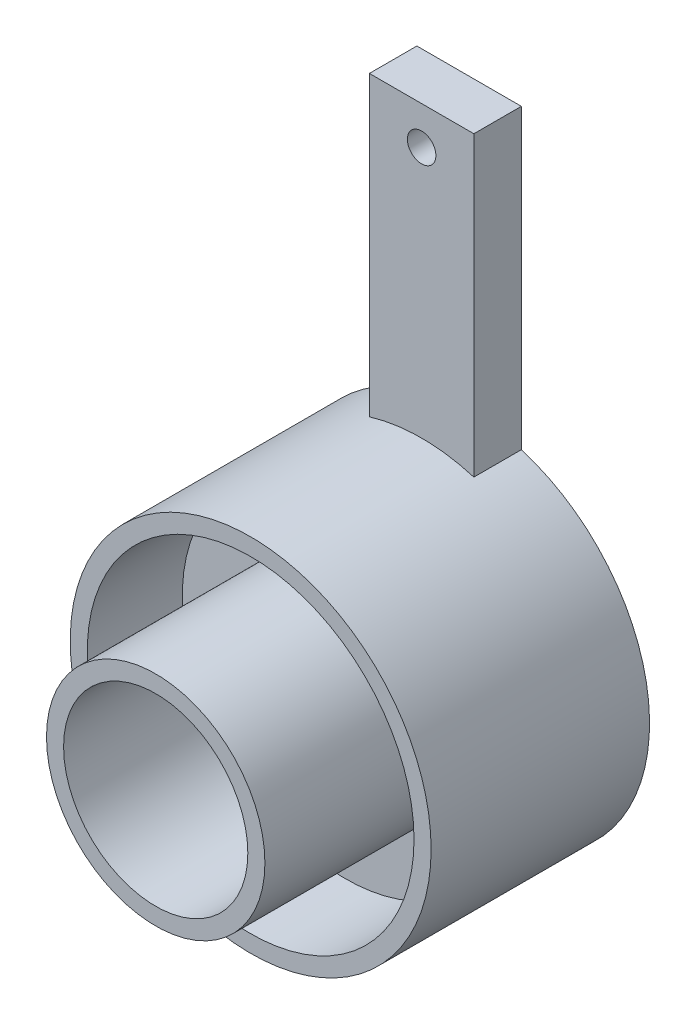
ISO-10303-21;
HEADER;
FILE_DESCRIPTION(('STEP AP214'),'2;1');
FILE_NAME('part.step','',(''),(''),'','','');
FILE_SCHEMA(('AUTOMOTIVE_DESIGN { 1 0 10303 214 1 1 1 1 }'));
ENDSEC;
DATA;
#1=APPLICATION_CONTEXT('core data for automotive mechanical design processes');
#2=APPLICATION_PROTOCOL_DEFINITION('international standard','automotive_design',2000,#1);
#3=PRODUCT_CONTEXT('',#1,'mechanical');
#4=PRODUCT('Part','Part','',(#3));
#5=PRODUCT_RELATED_PRODUCT_CATEGORY('part','',(#4));
#6=PRODUCT_DEFINITION_FORMATION('','',#4);
#7=PRODUCT_DEFINITION_CONTEXT('part definition',#1,'design');
#8=PRODUCT_DEFINITION('design','',#6,#7);
#9=PRODUCT_DEFINITION_SHAPE('','',#8);
#10=(LENGTH_UNIT() NAMED_UNIT(*) SI_UNIT(.MILLI.,.METRE.));
#11=(NAMED_UNIT(*) PLANE_ANGLE_UNIT() SI_UNIT($,.RADIAN.));
#12=(NAMED_UNIT(*) SI_UNIT($,.STERADIAN.) SOLID_ANGLE_UNIT());
#13=UNCERTAINTY_MEASURE_WITH_UNIT(LENGTH_MEASURE(1.E-05),#10,'distance_accuracy_value','');
#14=(GEOMETRIC_REPRESENTATION_CONTEXT(3) GLOBAL_UNCERTAINTY_ASSIGNED_CONTEXT((#13)) GLOBAL_UNIT_ASSIGNED_CONTEXT((#10,
#11,#12)) REPRESENTATION_CONTEXT('',''));
#15=CARTESIAN_POINT('',(0.,0.,0.));
#16=DIRECTION('',(0.,0.,1.));
#17=DIRECTION('',(1.,0.,0.));
#18=AXIS2_PLACEMENT_3D('',#15,#16,#17);
#19=CARTESIAN_POINT('',(0.,0.,23.));
#20=DIRECTION('',(0.,0.,-1.));
#21=DIRECTION('',(-1.,0.,0.));
#22=AXIS2_PLACEMENT_3D('',#19,#20,#21);
#23=CYLINDRICAL_SURFACE('',#22,19.);
#24=CARTESIAN_POINT('',(0.,0.,23.));
#25=DIRECTION('',(0.,0.,1.));
#26=DIRECTION('',(1.,0.,0.));
#27=AXIS2_PLACEMENT_3D('',#24,#25,#26);
#28=CIRCLE('',#27,19.);
#29=CARTESIAN_POINT('',(19.,0.,23.));
#30=VERTEX_POINT('',#29);
#31=EDGE_CURVE('E271',#30,#30,#28,.T.);
#32=ORIENTED_EDGE('',*,*,#31,.F.);
#33=EDGE_LOOP('',(#32));
#34=FACE_BOUND('',#33,.T.);
#35=CARTESIAN_POINT('',(0.,0.,0.));
#36=DIRECTION('',(0.,0.,1.));
#37=DIRECTION('',(1.,0.,0.));
#38=AXIS2_PLACEMENT_3D('',#35,#36,#37);
#39=CIRCLE('',#38,19.);
#40=CARTESIAN_POINT('',(-5.5,18.1865334794732,0.));
#41=VERTEX_POINT('',#40);
#42=CARTESIAN_POINT('',(5.5,18.1865334794732,0.));
#43=VERTEX_POINT('',#42);
#44=EDGE_CURVE('E268',#41,#43,#39,.T.);
#45=ORIENTED_EDGE('',*,*,#44,.T.);
#46=DIRECTION('',(0.,0.,-1.));
#47=VECTOR('',#46,1.);
#48=CARTESIAN_POINT('',(5.5,18.1865334794732,23.));
#49=LINE('',#48,#47);
#50=CARTESIAN_POINT('',(5.5,18.1865334794732,5.));
#51=VERTEX_POINT('',#50);
#52=EDGE_CURVE('E232',#43,#51,#49,.F.);
#53=ORIENTED_EDGE('',*,*,#52,.T.);
#54=CARTESIAN_POINT('',(0.,0.,5.));
#55=DIRECTION('',(0.,0.,-1.));
#56=DIRECTION('',(-1.,0.,0.));
#57=AXIS2_PLACEMENT_3D('',#54,#55,#56);
#58=CIRCLE('',#57,19.);
#59=CARTESIAN_POINT('',(-5.5,18.1865334794732,5.));
#60=VERTEX_POINT('',#59);
#61=EDGE_CURVE('E237',#60,#51,#58,.T.);
#62=ORIENTED_EDGE('',*,*,#61,.F.);
#63=DIRECTION('',(0.,0.,-1.));
#64=VECTOR('',#63,1.);
#65=CARTESIAN_POINT('',(-5.5,18.1865334794732,23.));
#66=LINE('',#65,#64);
#67=EDGE_CURVE('E227',#41,#60,#66,.F.);
#68=ORIENTED_EDGE('',*,*,#67,.F.);
#69=EDGE_LOOP('',(#45,#53,#62,#68));
#70=FACE_BOUND('',#69,.T.);
#71=ADVANCED_FACE('F36',(#34,#70),#23,.T.);
#72=CARTESIAN_POINT('',(0.,0.,23.));
#73=DIRECTION('',(0.,0.,1.));
#74=DIRECTION('',(1.,0.,0.));
#75=AXIS2_PLACEMENT_3D('',#72,#73,#74);
#76=PLANE('',#75);
#77=CARTESIAN_POINT('',(0.,0.,23.));
#78=DIRECTION('',(0.,0.,1.));
#79=DIRECTION('',(1.,0.,0.));
#80=AXIS2_PLACEMENT_3D('',#77,#78,#79);
#81=CIRCLE('',#80,17.2);
#82=CARTESIAN_POINT('',(17.2,0.,23.));
#83=VERTEX_POINT('',#82);
#84=EDGE_CURVE('E262',#83,#83,#81,.T.);
#85=ORIENTED_EDGE('',*,*,#84,.F.);
#86=EDGE_LOOP('',(#85));
#87=FACE_BOUND('',#86,.T.);
#88=ORIENTED_EDGE('',*,*,#31,.T.);
#89=EDGE_LOOP('',(#88));
#90=FACE_BOUND('',#89,.T.);
#91=ADVANCED_FACE('F313',(#87,#90),#76,.T.);
#92=CARTESIAN_POINT('',(0.,0.,0.));
#93=DIRECTION('',(0.,0.,1.));
#94=DIRECTION('',(1.,0.,0.));
#95=AXIS2_PLACEMENT_3D('',#92,#93,#94);
#96=PLANE('',#95);
#97=CARTESIAN_POINT('',(0.,45.5,0.));
#98=DIRECTION('',(0.,0.,-1.));
#99=DIRECTION('',(-1.,0.,0.));
#100=AXIS2_PLACEMENT_3D('',#97,#98,#99);
#101=CIRCLE('',#100,1.5);
#102=CARTESIAN_POINT('',(-1.5,45.5,0.));
#103=VERTEX_POINT('',#102);
#104=EDGE_CURVE('E301',#103,#103,#101,.T.);
#105=ORIENTED_EDGE('',*,*,#104,.F.);
#106=EDGE_LOOP('',(#105));
#107=FACE_BOUND('',#106,.T.);
#108=DIRECTION('',(0.988029503398198,-0.154265033026643,0.));
#109=VECTOR('',#108,1.);
#110=CARTESIAN_POINT('',(6.8709063836232,-2.36084183276174,0.));
#111=LINE('',#110,#109);
#112=CARTESIAN_POINT('',(6.8709063836232,-2.36084183276174,0.));
#113=VERTEX_POINT('',#112);
#114=CARTESIAN_POINT('',(9.30471822858186,-2.74084269645241,0.));
#115=VERTEX_POINT('',#114);
#116=EDGE_CURVE('E186',#113,#115,#111,.T.);
#117=ORIENTED_EDGE('',*,*,#116,.T.);
#118=CARTESIAN_POINT('',(0.,0.,0.));
#119=DIRECTION('',(0.,0.,-1.));
#120=DIRECTION('',(-1.,0.,0.));
#121=AXIS2_PLACEMENT_3D('',#118,#119,#120);
#122=CIRCLE('',#121,9.7);
#123=CARTESIAN_POINT('',(7.71247727898932,-5.88283045999743,0.));
#124=VERTEX_POINT('',#123);
#125=EDGE_CURVE('E240',#124,#115,#122,.T.);
#126=ORIENTED_EDGE('',*,*,#125,.F.);
#127=DIRECTION('',(-0.708657947835514,0.705552204283679,0.));
#128=VECTOR('',#127,1.);
#129=CARTESIAN_POINT('',(13.0534205171976,-11.2003666369099,0.));
#130=LINE('',#129,#128);
#131=CARTESIAN_POINT('',(5.96684103884249,-4.14484459407309,0.));
#132=VERTEX_POINT('',#131);
#133=EDGE_CURVE('E183',#124,#132,#130,.T.);
#134=ORIENTED_EDGE('',*,*,#133,.T.);
#135=DIRECTION('',(0.452032672390356,0.892001380655676,0.));
#136=VECTOR('',#135,1.);
#137=CARTESIAN_POINT('',(5.96684103884249,-4.14484459407309,0.));
#138=LINE('',#137,#136);
#139=EDGE_CURVE('E168',#132,#113,#138,.T.);
#140=ORIENTED_EDGE('',*,*,#139,.T.);
#141=EDGE_LOOP('',(#117,#126,#134,#140));
#142=FACE_BOUND('',#141,.T.);
#143=CARTESIAN_POINT('',(13.0534205171976,-11.2003666369099,0.));
#144=VERTEX_POINT('',#143);
#145=CARTESIAN_POINT('',(8.99742489110382,-7.16214669836813,0.));
#146=VERTEX_POINT('',#145);
#147=EDGE_CURVE('E181',#144,#146,#130,.T.);
#148=ORIENTED_EDGE('',*,*,#147,.T.);
#149=CARTESIAN_POINT('',(0.,0.,0.));
#150=DIRECTION('',(0.,0.,-1.));
#151=DIRECTION('',(-1.,0.,0.));
#152=AXIS2_PLACEMENT_3D('',#149,#150,#151);
#153=CIRCLE('',#152,11.5);
#154=CARTESIAN_POINT('',(-5.5,10.0995049383621,0.));
#155=VERTEX_POINT('',#154);
#156=EDGE_CURVE('E247',#146,#155,#153,.T.);
#157=ORIENTED_EDGE('',*,*,#156,.T.);
#158=DIRECTION('',(0.,1.,0.));
#159=VECTOR('',#158,1.);
#160=CARTESIAN_POINT('',(-5.5,0.,0.));
#161=LINE('',#160,#159);
#162=CARTESIAN_POINT('',(-5.5,16.2969322266493,0.));
#163=VERTEX_POINT('',#162);
#164=EDGE_CURVE('E216',#155,#163,#161,.T.);
#165=ORIENTED_EDGE('',*,*,#164,.T.);
#166=CARTESIAN_POINT('',(0.,0.,0.));
#167=DIRECTION('',(0.,0.,-1.));
#168=DIRECTION('',(-1.,0.,0.));
#169=AXIS2_PLACEMENT_3D('',#166,#167,#168);
#170=CIRCLE('',#169,17.2);
#171=EDGE_CURVE('E246',#144,#163,#170,.T.);
#172=ORIENTED_EDGE('',*,*,#171,.F.);
#173=EDGE_LOOP('',(#148,#157,#165,#172));
#174=FACE_BOUND('',#173,.T.);
#175=ORIENTED_EDGE('',*,*,#44,.F.);
#176=CARTESIAN_POINT('',(-5.5,49.5,0.));
#177=VERTEX_POINT('',#176);
#178=EDGE_CURVE('E214',#41,#177,#161,.T.);
#179=ORIENTED_EDGE('',*,*,#178,.T.);
#180=DIRECTION('',(-1.,0.,0.));
#181=VECTOR('',#180,1.);
#182=CARTESIAN_POINT('',(5.5,49.5,0.));
#183=LINE('',#182,#181);
#184=CARTESIAN_POINT('',(5.5,49.5,0.));
#185=VERTEX_POINT('',#184);
#186=EDGE_CURVE('E221',#185,#177,#183,.T.);
#187=ORIENTED_EDGE('',*,*,#186,.F.);
#188=DIRECTION('',(0.,1.,0.));
#189=VECTOR('',#188,1.);
#190=CARTESIAN_POINT('',(5.5,0.,0.));
#191=LINE('',#190,#189);
#192=EDGE_CURVE('E204',#43,#185,#191,.T.);
#193=ORIENTED_EDGE('',*,*,#192,.F.);
#194=EDGE_LOOP('',(#175,#179,#187,#193));
#195=FACE_BOUND('',#194,.T.);
#196=CARTESIAN_POINT('',(5.5,10.0995049383621,0.));
#197=VERTEX_POINT('',#196);
#198=CARTESIAN_POINT('',(11.0962259015966,-3.02055801810482,0.));
#199=VERTEX_POINT('',#198);
#200=EDGE_CURVE('E243',#197,#199,#153,.T.);
#201=ORIENTED_EDGE('',*,*,#200,.T.);
#202=CARTESIAN_POINT('',(16.7512014176052,-3.90349216302817,0.));
#203=VERTEX_POINT('',#202);
#204=EDGE_CURVE('E185',#199,#203,#111,.T.);
#205=ORIENTED_EDGE('',*,*,#204,.T.);
#206=CARTESIAN_POINT('',(5.5,16.2969322266493,0.));
#207=VERTEX_POINT('',#206);
#208=EDGE_CURVE('E254',#207,#203,#170,.T.);
#209=ORIENTED_EDGE('',*,*,#208,.F.);
#210=EDGE_CURVE('E207',#197,#207,#191,.T.);
#211=ORIENTED_EDGE('',*,*,#210,.F.);
#212=EDGE_LOOP('',(#201,#205,#209,#211));
#213=FACE_BOUND('',#212,.T.);
#214=ADVANCED_FACE('F298',(#107,#142,#174,#195,#213),#96,.F.);
#215=CARTESIAN_POINT('',(0.,0.,13.));
#216=DIRECTION('',(0.,0.,1.));
#217=DIRECTION('',(1.,0.,0.));
#218=AXIS2_PLACEMENT_3D('',#215,#216,#217);
#219=CYLINDRICAL_SURFACE('',#218,17.2);
#220=CARTESIAN_POINT('',(0.,0.,13.));
#221=DIRECTION('',(0.,0.,1.));
#222=DIRECTION('',(1.,0.,0.));
#223=AXIS2_PLACEMENT_3D('',#220,#221,#222);
#224=CIRCLE('',#223,17.2);
#225=CARTESIAN_POINT('',(17.2,0.,13.));
#226=VERTEX_POINT('',#225);
#227=EDGE_CURVE('E265',#226,#226,#224,.T.);
#228=ORIENTED_EDGE('',*,*,#227,.F.);
#229=EDGE_LOOP('',(#228));
#230=FACE_BOUND('',#229,.T.);
#231=ORIENTED_EDGE('',*,*,#84,.T.);
#232=EDGE_LOOP('',(#231));
#233=FACE_BOUND('',#232,.T.);
#234=ADVANCED_FACE('F312',(#230,#233),#219,.F.);
#235=CARTESIAN_POINT('',(0.,0.,13.));
#236=DIRECTION('',(0.,0.,1.));
#237=DIRECTION('',(1.,0.,0.));
#238=AXIS2_PLACEMENT_3D('',#235,#236,#237);
#239=PLANE('',#238);
#240=CARTESIAN_POINT('',(0.,0.,13.));
#241=DIRECTION('',(0.,0.,1.));
#242=DIRECTION('',(1.,0.,0.));
#243=AXIS2_PLACEMENT_3D('',#240,#241,#242);
#244=CIRCLE('',#243,11.5);
#245=CARTESIAN_POINT('',(11.5,0.,13.));
#246=VERTEX_POINT('',#245);
#247=EDGE_CURVE('E258',#246,#246,#244,.T.);
#248=ORIENTED_EDGE('',*,*,#247,.F.);
#249=EDGE_LOOP('',(#248));
#250=FACE_BOUND('',#249,.T.);
#251=ORIENTED_EDGE('',*,*,#227,.T.);
#252=EDGE_LOOP('',(#251));
#253=FACE_BOUND('',#252,.T.);
#254=ADVANCED_FACE('F318',(#250,#253),#239,.T.);
#255=CARTESIAN_POINT('',(0.,0.,33.));
#256=DIRECTION('',(0.,0.,1.));
#257=DIRECTION('',(1.,0.,0.));
#258=AXIS2_PLACEMENT_3D('',#255,#256,#257);
#259=PLANE('',#258);
#260=CARTESIAN_POINT('',(0.,0.,33.));
#261=DIRECTION('',(0.,0.,1.));
#262=DIRECTION('',(1.,0.,0.));
#263=AXIS2_PLACEMENT_3D('',#260,#261,#262);
#264=CIRCLE('',#263,11.5);
#265=CARTESIAN_POINT('',(11.5,0.,33.));
#266=VERTEX_POINT('',#265);
#267=EDGE_CURVE('E259',#266,#266,#264,.T.);
#268=ORIENTED_EDGE('',*,*,#267,.T.);
#269=EDGE_LOOP('',(#268));
#270=FACE_BOUND('',#269,.T.);
#271=CARTESIAN_POINT('',(0.,0.,33.));
#272=DIRECTION('',(0.,0.,1.));
#273=DIRECTION('',(1.,0.,0.));
#274=AXIS2_PLACEMENT_3D('',#271,#272,#273);
#275=CIRCLE('',#274,9.7);
#276=CARTESIAN_POINT('',(9.7,0.,33.));
#277=VERTEX_POINT('',#276);
#278=EDGE_CURVE('E253',#277,#277,#275,.T.);
#279=ORIENTED_EDGE('',*,*,#278,.F.);
#280=EDGE_LOOP('',(#279));
#281=FACE_BOUND('',#280,.T.);
#282=ADVANCED_FACE('F423',(#270,#281),#259,.T.);
#283=CARTESIAN_POINT('',(0.,0.,33.));
#284=DIRECTION('',(0.,0.,-1.));
#285=DIRECTION('',(-1.,0.,0.));
#286=AXIS2_PLACEMENT_3D('',#283,#284,#285);
#287=CYLINDRICAL_SURFACE('',#286,11.5);
#288=ORIENTED_EDGE('',*,*,#267,.F.);
#289=EDGE_LOOP('',(#288));
#290=FACE_BOUND('',#289,.T.);
#291=ORIENTED_EDGE('',*,*,#247,.T.);
#292=EDGE_LOOP('',(#291));
#293=FACE_BOUND('',#292,.T.);
#294=ADVANCED_FACE('F421',(#290,#293),#287,.T.);
#295=CARTESIAN_POINT('',(0.,0.,33.));
#296=DIRECTION('',(0.,0.,-1.));
#297=DIRECTION('',(-1.,0.,0.));
#298=AXIS2_PLACEMENT_3D('',#295,#296,#297);
#299=CYLINDRICAL_SURFACE('',#298,9.7);
#300=ORIENTED_EDGE('',*,*,#278,.T.);
#301=EDGE_LOOP('',(#300));
#302=FACE_BOUND('',#301,.T.);
#303=CARTESIAN_POINT('',(0.,0.,13.));
#304=DIRECTION('',(0.,0.,1.));
#305=DIRECTION('',(1.,0.,0.));
#306=AXIS2_PLACEMENT_3D('',#303,#304,#305);
#307=CIRCLE('',#306,9.7);
#308=CARTESIAN_POINT('',(9.7,0.,13.));
#309=VERTEX_POINT('',#308);
#310=EDGE_CURVE('E274',#309,#309,#307,.F.);
#311=ORIENTED_EDGE('',*,*,#310,.T.);
#312=EDGE_LOOP('',(#311));
#313=FACE_BOUND('',#312,.T.);
#314=ADVANCED_FACE('F415',(#302,#313),#299,.F.);
#315=ORIENTED_EDGE('',*,*,#310,.F.);
#316=EDGE_LOOP('',(#315));
#317=FACE_BOUND('',#316,.T.);
#318=ADVANCED_FACE('F410',(#317),#239,.T.);
#319=CARTESIAN_POINT('',(0.,0.,10.));
#320=DIRECTION('',(0.,0.,-1.));
#321=DIRECTION('',(-1.,0.,0.));
#322=AXIS2_PLACEMENT_3D('',#319,#320,#321);
#323=CYLINDRICAL_SURFACE('',#322,17.2);
#324=ORIENTED_EDGE('',*,*,#208,.T.);
#325=DIRECTION('',(0.,0.,-1.));
#326=VECTOR('',#325,1.);
#327=CARTESIAN_POINT('',(16.7512014176052,-3.90349216302817,2.4));
#328=LINE('',#327,#326);
#329=CARTESIAN_POINT('',(16.7512014176052,-3.90349216302817,2.4));
#330=VERTEX_POINT('',#329);
#331=EDGE_CURVE('E51',#330,#203,#328,.T.);
#332=ORIENTED_EDGE('',*,*,#331,.F.);
#333=CARTESIAN_POINT('',(0.,0.,2.4));
#334=DIRECTION('',(0.,0.,-1.));
#335=DIRECTION('',(-1.,0.,0.));
#336=AXIS2_PLACEMENT_3D('',#333,#334,#335);
#337=CIRCLE('',#336,17.2);
#338=CARTESIAN_POINT('',(13.0534205171976,-11.2003666369099,2.4));
#339=VERTEX_POINT('',#338);
#340=EDGE_CURVE('E56',#330,#339,#337,.T.);
#341=ORIENTED_EDGE('',*,*,#340,.T.);
#342=DIRECTION('',(0.,0.,-1.));
#343=VECTOR('',#342,1.);
#344=CARTESIAN_POINT('',(13.0534205171976,-11.2003666369099,2.4));
#345=LINE('',#344,#343);
#346=EDGE_CURVE('E170',#339,#144,#345,.T.);
#347=ORIENTED_EDGE('',*,*,#346,.T.);
#348=ORIENTED_EDGE('',*,*,#171,.T.);
#349=DIRECTION('',(0.,0.,-1.));
#350=VECTOR('',#349,1.);
#351=CARTESIAN_POINT('',(-5.5,16.2969322266493,10.));
#352=LINE('',#351,#350);
#353=CARTESIAN_POINT('',(-5.5,16.2969322266493,5.));
#354=VERTEX_POINT('',#353);
#355=EDGE_CURVE('E224',#354,#163,#352,.T.);
#356=ORIENTED_EDGE('',*,*,#355,.F.);
#357=CARTESIAN_POINT('',(0.,0.,5.));
#358=DIRECTION('',(0.,0.,-1.));
#359=DIRECTION('',(-1.,0.,0.));
#360=AXIS2_PLACEMENT_3D('',#357,#358,#359);
#361=CIRCLE('',#360,17.2);
#362=CARTESIAN_POINT('',(5.5,16.2969322266493,5.));
#363=VERTEX_POINT('',#362);
#364=EDGE_CURVE('E234',#363,#354,#361,.F.);
#365=ORIENTED_EDGE('',*,*,#364,.F.);
#366=DIRECTION('',(0.,0.,-1.));
#367=VECTOR('',#366,1.);
#368=CARTESIAN_POINT('',(5.5,16.2969322266493,10.));
#369=LINE('',#368,#367);
#370=EDGE_CURVE('E230',#363,#207,#369,.T.);
#371=ORIENTED_EDGE('',*,*,#370,.T.);
#372=EDGE_LOOP('',(#324,#332,#341,#347,#348,#356,#365,#371));
#373=FACE_BOUND('',#372,.T.);
#374=CARTESIAN_POINT('',(0.,0.,10.));
#375=DIRECTION('',(0.,0.,-1.));
#376=DIRECTION('',(-1.,0.,0.));
#377=AXIS2_PLACEMENT_3D('',#374,#375,#376);
#378=CIRCLE('',#377,17.2);
#379=CARTESIAN_POINT('',(-17.2,0.,10.));
#380=VERTEX_POINT('',#379);
#381=EDGE_CURVE('E250',#380,#380,#378,.T.);
#382=ORIENTED_EDGE('',*,*,#381,.F.);
#383=EDGE_LOOP('',(#382));
#384=FACE_BOUND('',#383,.T.);
#385=ADVANCED_FACE('F378',(#373,#384),#323,.F.);
#386=CARTESIAN_POINT('',(0.,0.,10.));
#387=DIRECTION('',(0.,0.,-1.));
#388=DIRECTION('',(-1.,0.,0.));
#389=AXIS2_PLACEMENT_3D('',#386,#387,#388);
#390=PLANE('',#389);
#391=CARTESIAN_POINT('',(0.,0.,10.));
#392=DIRECTION('',(0.,0.,-1.));
#393=DIRECTION('',(-1.,0.,0.));
#394=AXIS2_PLACEMENT_3D('',#391,#392,#393);
#395=CIRCLE('',#394,11.5);
#396=CARTESIAN_POINT('',(-11.5,0.,10.));
#397=VERTEX_POINT('',#396);
#398=EDGE_CURVE('E242',#397,#397,#395,.T.);
#399=ORIENTED_EDGE('',*,*,#398,.F.);
#400=EDGE_LOOP('',(#399));
#401=FACE_BOUND('',#400,.T.);
#402=ORIENTED_EDGE('',*,*,#381,.T.);
#403=EDGE_LOOP('',(#402));
#404=FACE_BOUND('',#403,.T.);
#405=ADVANCED_FACE('F401',(#401,#404),#390,.T.);
#406=CARTESIAN_POINT('',(0.,0.,0.));
#407=DIRECTION('',(0.,0.,1.));
#408=DIRECTION('',(1.,0.,0.));
#409=AXIS2_PLACEMENT_3D('',#406,#407,#408);
#410=CYLINDRICAL_SURFACE('',#409,11.5);
#411=CARTESIAN_POINT('',(0.,0.,2.4));
#412=DIRECTION('',(0.,0.,-1.));
#413=DIRECTION('',(-1.,0.,0.));
#414=AXIS2_PLACEMENT_3D('',#411,#412,#413);
#415=CIRCLE('',#414,11.5);
#416=CARTESIAN_POINT('',(11.0962259015966,-3.02055801810482,2.4));
#417=VERTEX_POINT('',#416);
#418=CARTESIAN_POINT('',(8.99742489110382,-7.16214669836813,2.4));
#419=VERTEX_POINT('',#418);
#420=EDGE_CURVE('E190',#417,#419,#415,.T.);
#421=ORIENTED_EDGE('',*,*,#420,.F.);
#422=DIRECTION('',(0.,0.,1.));
#423=VECTOR('',#422,1.);
#424=CARTESIAN_POINT('',(11.0962259015966,-3.02055801810482,0.));
#425=LINE('',#424,#423);
#426=EDGE_CURVE('E197',#417,#199,#425,.F.);
#427=ORIENTED_EDGE('',*,*,#426,.T.);
#428=ORIENTED_EDGE('',*,*,#200,.F.);
#429=DIRECTION('',(0.,0.,1.));
#430=VECTOR('',#429,1.);
#431=CARTESIAN_POINT('',(5.5,10.0995049383621,0.));
#432=LINE('',#431,#430);
#433=CARTESIAN_POINT('',(5.5,10.0995049383621,5.));
#434=VERTEX_POINT('',#433);
#435=EDGE_CURVE('E287',#197,#434,#432,.T.);
#436=ORIENTED_EDGE('',*,*,#435,.T.);
#437=CARTESIAN_POINT('',(0.,0.,5.));
#438=DIRECTION('',(0.,0.,-1.));
#439=DIRECTION('',(-1.,0.,0.));
#440=AXIS2_PLACEMENT_3D('',#437,#438,#439);
#441=CIRCLE('',#440,11.5);
#442=CARTESIAN_POINT('',(-5.5,10.0995049383621,5.));
#443=VERTEX_POINT('',#442);
#444=EDGE_CURVE('E284',#443,#434,#441,.T.);
#445=ORIENTED_EDGE('',*,*,#444,.F.);
#446=DIRECTION('',(0.,0.,1.));
#447=VECTOR('',#446,1.);
#448=CARTESIAN_POINT('',(-5.5,10.0995049383621,0.));
#449=LINE('',#448,#447);
#450=EDGE_CURVE('E281',#155,#443,#449,.T.);
#451=ORIENTED_EDGE('',*,*,#450,.F.);
#452=ORIENTED_EDGE('',*,*,#156,.F.);
#453=DIRECTION('',(0.,0.,1.));
#454=VECTOR('',#453,1.);
#455=CARTESIAN_POINT('',(8.99742489110382,-7.16214669836813,0.));
#456=LINE('',#455,#454);
#457=EDGE_CURVE('E194',#146,#419,#456,.T.);
#458=ORIENTED_EDGE('',*,*,#457,.T.);
#459=EDGE_LOOP('',(#421,#427,#428,#436,#445,#451,#452,#458));
#460=FACE_BOUND('',#459,.T.);
#461=ORIENTED_EDGE('',*,*,#398,.T.);
#462=EDGE_LOOP('',(#461));
#463=FACE_BOUND('',#462,.T.);
#464=ADVANCED_FACE('F398',(#460,#463),#410,.T.);
#465=CARTESIAN_POINT('',(0.,0.,0.));
#466=DIRECTION('',(0.,0.,1.));
#467=DIRECTION('',(1.,0.,0.));
#468=AXIS2_PLACEMENT_3D('',#465,#466,#467);
#469=CYLINDRICAL_SURFACE('',#468,9.7);
#470=DIRECTION('',(0.,0.,1.));
#471=VECTOR('',#470,1.);
#472=CARTESIAN_POINT('',(9.30471822858186,-2.74084269645241,0.));
#473=LINE('',#472,#471);
#474=CARTESIAN_POINT('',(9.30471822858186,-2.74084269645241,2.4));
#475=VERTEX_POINT('',#474);
#476=EDGE_CURVE('E11',#475,#115,#473,.F.);
#477=ORIENTED_EDGE('',*,*,#476,.F.);
#478=CARTESIAN_POINT('',(0.,0.,2.4));
#479=DIRECTION('',(0.,0.,-1.));
#480=DIRECTION('',(-1.,0.,0.));
#481=AXIS2_PLACEMENT_3D('',#478,#479,#480);
#482=CIRCLE('',#481,9.7);
#483=CARTESIAN_POINT('',(7.71247727898932,-5.88283045999743,2.4));
#484=VERTEX_POINT('',#483);
#485=EDGE_CURVE('E289',#475,#484,#482,.T.);
#486=ORIENTED_EDGE('',*,*,#485,.T.);
#487=DIRECTION('',(0.,0.,1.));
#488=VECTOR('',#487,1.);
#489=CARTESIAN_POINT('',(7.71247727898932,-5.88283045999743,0.));
#490=LINE('',#489,#488);
#491=EDGE_CURVE('E44',#124,#484,#490,.T.);
#492=ORIENTED_EDGE('',*,*,#491,.F.);
#493=ORIENTED_EDGE('',*,*,#125,.T.);
#494=EDGE_LOOP('',(#477,#486,#492,#493));
#495=FACE_BOUND('',#494,.T.);
#496=CARTESIAN_POINT('',(0.,0.,10.));
#497=DIRECTION('',(0.,0.,-1.));
#498=DIRECTION('',(-1.,0.,0.));
#499=AXIS2_PLACEMENT_3D('',#496,#497,#498);
#500=CIRCLE('',#499,9.7);
#501=CARTESIAN_POINT('',(-9.7,0.,10.));
#502=VERTEX_POINT('',#501);
#503=EDGE_CURVE('E278',#502,#502,#500,.F.);
#504=ORIENTED_EDGE('',*,*,#503,.T.);
#505=EDGE_LOOP('',(#504));
#506=FACE_BOUND('',#505,.T.);
#507=ADVANCED_FACE('F292',(#495,#506),#469,.F.);
#508=ORIENTED_EDGE('',*,*,#503,.F.);
#509=EDGE_LOOP('',(#508));
#510=FACE_BOUND('',#509,.T.);
#511=ADVANCED_FACE('F368',(#510),#390,.T.);
#512=CARTESIAN_POINT('',(5.5,0.,0.));
#513=DIRECTION('',(1.,0.,0.));
#514=DIRECTION('',(0.,0.,-1.));
#515=AXIS2_PLACEMENT_3D('',#512,#513,#514);
#516=PLANE('',#515);
#517=ORIENTED_EDGE('',*,*,#370,.F.);
#518=DIRECTION('',(0.,-1.,0.));
#519=VECTOR('',#518,1.);
#520=CARTESIAN_POINT('',(5.5,0.,5.));
#521=LINE('',#520,#519);
#522=EDGE_CURVE('E205',#363,#434,#521,.T.);
#523=ORIENTED_EDGE('',*,*,#522,.T.);
#524=ORIENTED_EDGE('',*,*,#435,.F.);
#525=ORIENTED_EDGE('',*,*,#210,.T.);
#526=EDGE_LOOP('',(#517,#523,#524,#525));
#527=FACE_BOUND('',#526,.T.);
#528=ADVANCED_FACE('F358',(#527),#516,.T.);
#529=CARTESIAN_POINT('',(-5.5,0.,0.));
#530=DIRECTION('',(1.,0.,0.));
#531=DIRECTION('',(0.,0.,-1.));
#532=AXIS2_PLACEMENT_3D('',#529,#530,#531);
#533=PLANE('',#532);
#534=DIRECTION('',(0.,-1.,0.));
#535=VECTOR('',#534,1.);
#536=CARTESIAN_POINT('',(-5.5,0.,5.));
#537=LINE('',#536,#535);
#538=EDGE_CURVE('E200',#354,#443,#537,.T.);
#539=ORIENTED_EDGE('',*,*,#538,.F.);
#540=ORIENTED_EDGE('',*,*,#355,.T.);
#541=ORIENTED_EDGE('',*,*,#164,.F.);
#542=ORIENTED_EDGE('',*,*,#450,.T.);
#543=EDGE_LOOP('',(#539,#540,#541,#542));
#544=FACE_BOUND('',#543,.T.);
#545=ADVANCED_FACE('F351',(#544),#533,.F.);
#546=CARTESIAN_POINT('',(5.5,0.,5.));
#547=DIRECTION('',(0.,0.,-1.));
#548=DIRECTION('',(-1.,0.,0.));
#549=AXIS2_PLACEMENT_3D('',#546,#547,#548);
#550=PLANE('',#549);
#551=ORIENTED_EDGE('',*,*,#522,.F.);
#552=ORIENTED_EDGE('',*,*,#364,.T.);
#553=ORIENTED_EDGE('',*,*,#538,.T.);
#554=ORIENTED_EDGE('',*,*,#444,.T.);
#555=EDGE_LOOP('',(#551,#552,#553,#554));
#556=FACE_BOUND('',#555,.T.);
#557=ADVANCED_FACE('F360',(#556),#550,.F.);
#558=CARTESIAN_POINT('',(0.,45.5,5.));
#559=DIRECTION('',(0.,0.,-1.));
#560=DIRECTION('',(-1.,0.,0.));
#561=AXIS2_PLACEMENT_3D('',#558,#559,#560);
#562=CIRCLE('',#561,1.5);
#563=CARTESIAN_POINT('',(-1.5,45.5,5.));
#564=VERTEX_POINT('',#563);
#565=EDGE_CURVE('E39',#564,#564,#562,.T.);
#566=ORIENTED_EDGE('',*,*,#565,.T.);
#567=EDGE_LOOP('',(#566));
#568=FACE_BOUND('',#567,.T.);
#569=CARTESIAN_POINT('',(-5.5,49.5,5.));
#570=VERTEX_POINT('',#569);
#571=EDGE_CURVE('E211',#570,#60,#537,.T.);
#572=ORIENTED_EDGE('',*,*,#571,.T.);
#573=ORIENTED_EDGE('',*,*,#61,.T.);
#574=CARTESIAN_POINT('',(5.5,49.5,5.));
#575=VERTEX_POINT('',#574);
#576=EDGE_CURVE('E201',#575,#51,#521,.T.);
#577=ORIENTED_EDGE('',*,*,#576,.F.);
#578=DIRECTION('',(-1.,0.,0.));
#579=VECTOR('',#578,1.);
#580=CARTESIAN_POINT('',(5.5,49.5,5.));
#581=LINE('',#580,#579);
#582=EDGE_CURVE('E210',#575,#570,#581,.T.);
#583=ORIENTED_EDGE('',*,*,#582,.T.);
#584=EDGE_LOOP('',(#572,#573,#577,#583));
#585=FACE_BOUND('',#584,.T.);
#586=ADVANCED_FACE('F346',(#568,#585),#550,.F.);
#587=ORIENTED_EDGE('',*,*,#52,.F.);
#588=ORIENTED_EDGE('',*,*,#192,.T.);
#589=DIRECTION('',(0.,0.,1.));
#590=VECTOR('',#589,1.);
#591=CARTESIAN_POINT('',(5.5,49.5,0.));
#592=LINE('',#591,#590);
#593=EDGE_CURVE('E208',#185,#575,#592,.T.);
#594=ORIENTED_EDGE('',*,*,#593,.T.);
#595=ORIENTED_EDGE('',*,*,#576,.T.);
#596=EDGE_LOOP('',(#587,#588,#594,#595));
#597=FACE_BOUND('',#596,.T.);
#598=ADVANCED_FACE('F335',(#597),#516,.T.);
#599=ORIENTED_EDGE('',*,*,#178,.F.);
#600=ORIENTED_EDGE('',*,*,#67,.T.);
#601=ORIENTED_EDGE('',*,*,#571,.F.);
#602=DIRECTION('',(0.,0.,1.));
#603=VECTOR('',#602,1.);
#604=CARTESIAN_POINT('',(-5.5,49.5,0.));
#605=LINE('',#604,#603);
#606=EDGE_CURVE('E217',#177,#570,#605,.T.);
#607=ORIENTED_EDGE('',*,*,#606,.F.);
#608=EDGE_LOOP('',(#599,#600,#601,#607));
#609=FACE_BOUND('',#608,.T.);
#610=ADVANCED_FACE('F348',(#609),#533,.F.);
#611=CARTESIAN_POINT('',(5.5,49.5,0.));
#612=DIRECTION('',(0.,-1.,0.));
#613=DIRECTION('',(0.,0.,-1.));
#614=AXIS2_PLACEMENT_3D('',#611,#612,#613);
#615=PLANE('',#614);
#616=ORIENTED_EDGE('',*,*,#606,.T.);
#617=ORIENTED_EDGE('',*,*,#582,.F.);
#618=ORIENTED_EDGE('',*,*,#593,.F.);
#619=ORIENTED_EDGE('',*,*,#186,.T.);
#620=EDGE_LOOP('',(#616,#617,#618,#619));
#621=FACE_BOUND('',#620,.T.);
#622=ADVANCED_FACE('F343',(#621),#615,.F.);
#623=CARTESIAN_POINT('',(13.0534205171976,-11.2003666369099,2.4));
#624=DIRECTION('',(-0.705552204283679,-0.708657947835514,0.));
#625=DIRECTION('',(0.708657947835514,-0.705552204283679,0.));
#626=AXIS2_PLACEMENT_3D('',#623,#624,#625);
#627=PLANE('',#626);
#628=ORIENTED_EDGE('',*,*,#133,.F.);
#629=ORIENTED_EDGE('',*,*,#491,.T.);
#630=DIRECTION('',(-0.708657947835514,0.705552204283679,0.));
#631=VECTOR('',#630,1.);
#632=CARTESIAN_POINT('',(13.0534205171976,-11.2003666369099,2.4));
#633=LINE('',#632,#631);
#634=CARTESIAN_POINT('',(5.96684103884249,-4.14484459407309,2.4));
#635=VERTEX_POINT('',#634);
#636=EDGE_CURVE('E150',#484,#635,#633,.T.);
#637=ORIENTED_EDGE('',*,*,#636,.T.);
#638=DIRECTION('',(0.,0.,-1.));
#639=VECTOR('',#638,1.);
#640=CARTESIAN_POINT('',(5.96684103884249,-4.14484459407309,2.4));
#641=LINE('',#640,#639);
#642=EDGE_CURVE('E154',#635,#132,#641,.T.);
#643=ORIENTED_EDGE('',*,*,#642,.T.);
#644=EDGE_LOOP('',(#628,#629,#637,#643));
#645=FACE_BOUND('',#644,.T.);
#646=ADVANCED_FACE('F153',(#645),#627,.T.);
#647=CARTESIAN_POINT('',(5.96684103884249,-4.14484459407309,2.4));
#648=DIRECTION('',(-0.892001380655676,0.452032672390356,0.));
#649=DIRECTION('',(-0.452032672390356,-0.892001380655676,0.));
#650=AXIS2_PLACEMENT_3D('',#647,#648,#649);
#651=PLANE('',#650);
#652=ORIENTED_EDGE('',*,*,#139,.F.);
#653=ORIENTED_EDGE('',*,*,#642,.F.);
#654=DIRECTION('',(0.452032672390356,0.892001380655676,0.));
#655=VECTOR('',#654,1.);
#656=CARTESIAN_POINT('',(5.96684103884249,-4.14484459407309,2.4));
#657=LINE('',#656,#655);
#658=CARTESIAN_POINT('',(6.8709063836232,-2.36084183276174,2.4));
#659=VERTEX_POINT('',#658);
#660=EDGE_CURVE('E165',#635,#659,#657,.T.);
#661=ORIENTED_EDGE('',*,*,#660,.T.);
#662=DIRECTION('',(0.,0.,-1.));
#663=VECTOR('',#662,1.);
#664=CARTESIAN_POINT('',(6.8709063836232,-2.36084183276174,2.4));
#665=LINE('',#664,#663);
#666=EDGE_CURVE('E169',#659,#113,#665,.T.);
#667=ORIENTED_EDGE('',*,*,#666,.T.);
#668=EDGE_LOOP('',(#652,#653,#661,#667));
#669=FACE_BOUND('',#668,.T.);
#670=ADVANCED_FACE('F164',(#669),#651,.T.);
#671=CARTESIAN_POINT('',(6.8709063836232,-2.36084183276174,2.4));
#672=DIRECTION('',(0.154265033026643,0.988029503398198,0.));
#673=DIRECTION('',(-0.988029503398198,0.154265033026643,0.));
#674=AXIS2_PLACEMENT_3D('',#671,#672,#673);
#675=PLANE('',#674);
#676=DIRECTION('',(0.988029503398198,-0.154265033026643,0.));
#677=VECTOR('',#676,1.);
#678=CARTESIAN_POINT('',(6.8709063836232,-2.36084183276174,2.4));
#679=LINE('',#678,#677);
#680=EDGE_CURVE('E174',#659,#475,#679,.T.);
#681=ORIENTED_EDGE('',*,*,#680,.T.);
#682=ORIENTED_EDGE('',*,*,#476,.T.);
#683=ORIENTED_EDGE('',*,*,#116,.F.);
#684=ORIENTED_EDGE('',*,*,#666,.F.);
#685=EDGE_LOOP('',(#681,#682,#683,#684));
#686=FACE_BOUND('',#685,.T.);
#687=ADVANCED_FACE('F295',(#686),#675,.T.);
#688=CARTESIAN_POINT('',(0.,0.,2.4));
#689=DIRECTION('',(0.,0.,-1.));
#690=DIRECTION('',(-1.,0.,0.));
#691=AXIS2_PLACEMENT_3D('',#688,#689,#690);
#692=PLANE('',#691);
#693=ORIENTED_EDGE('',*,*,#485,.F.);
#694=ORIENTED_EDGE('',*,*,#680,.F.);
#695=ORIENTED_EDGE('',*,*,#660,.F.);
#696=ORIENTED_EDGE('',*,*,#636,.F.);
#697=EDGE_LOOP('',(#693,#694,#695,#696));
#698=FACE_BOUND('',#697,.T.);
#699=ADVANCED_FACE('F172',(#698),#692,.F.);
#700=ORIENTED_EDGE('',*,*,#426,.F.);
#701=EDGE_CURVE('E175',#417,#330,#679,.T.);
#702=ORIENTED_EDGE('',*,*,#701,.T.);
#703=ORIENTED_EDGE('',*,*,#331,.T.);
#704=ORIENTED_EDGE('',*,*,#204,.F.);
#705=EDGE_LOOP('',(#700,#702,#703,#704));
#706=FACE_BOUND('',#705,.T.);
#707=ADVANCED_FACE('F386',(#706),#675,.T.);
#708=ORIENTED_EDGE('',*,*,#457,.F.);
#709=ORIENTED_EDGE('',*,*,#147,.F.);
#710=ORIENTED_EDGE('',*,*,#346,.F.);
#711=EDGE_CURVE('E160',#339,#419,#633,.T.);
#712=ORIENTED_EDGE('',*,*,#711,.T.);
#713=EDGE_LOOP('',(#708,#709,#710,#712));
#714=FACE_BOUND('',#713,.T.);
#715=ADVANCED_FACE('F394',(#714),#627,.T.);
#716=ORIENTED_EDGE('',*,*,#701,.F.);
#717=ORIENTED_EDGE('',*,*,#420,.T.);
#718=ORIENTED_EDGE('',*,*,#711,.F.);
#719=ORIENTED_EDGE('',*,*,#340,.F.);
#720=EDGE_LOOP('',(#716,#717,#718,#719));
#721=FACE_BOUND('',#720,.T.);
#722=ADVANCED_FACE('F391',(#721),#692,.F.);
#723=CARTESIAN_POINT('',(0.,45.5,33.));
#724=DIRECTION('',(0.,0.,-1.));
#725=DIRECTION('',(-1.,0.,0.));
#726=AXIS2_PLACEMENT_3D('',#723,#724,#725);
#727=CYLINDRICAL_SURFACE('',#726,1.5);
#728=ORIENTED_EDGE('',*,*,#104,.T.);
#729=EDGE_LOOP('',(#728));
#730=FACE_BOUND('',#729,.T.);
#731=ORIENTED_EDGE('',*,*,#565,.F.);
#732=EDGE_LOOP('',(#731));
#733=FACE_BOUND('',#732,.T.);
#734=ADVANCED_FACE('F308',(#730,#733),#727,.F.);
#735=CLOSED_SHELL('',(#71,#91,#214,#234,#254,#282,#294,#314,#318,#385,#405,#464,#507,#511,#528,
#545,#557,#586,#598,#610,#622,#646,#670,#687,#699,#707,#715,#722,#734));
#736=MANIFOLD_SOLID_BREP('B2',#735);
#737=ADVANCED_BREP_SHAPE_REPRESENTATION('',(#18,#736),#14);
#738=SHAPE_DEFINITION_REPRESENTATION(#9,#737);
ENDSEC;
END-ISO-10303-21;
